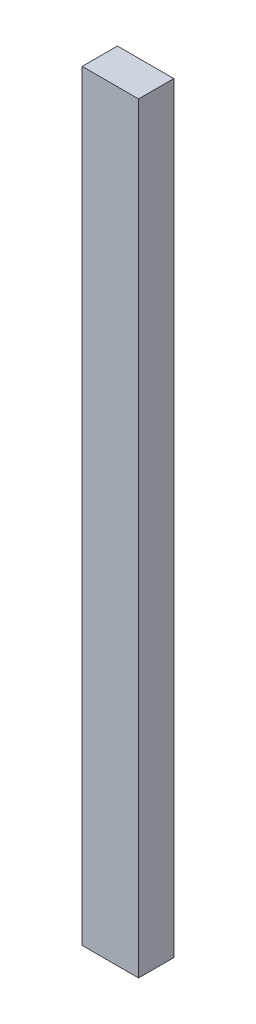
ISO-10303-21;
HEADER;
FILE_DESCRIPTION(('STEP AP214'),'2;1');
FILE_NAME('part.step','',(''),(''),'','','');
FILE_SCHEMA(('AUTOMOTIVE_DESIGN { 1 0 10303 214 1 1 1 1 }'));
ENDSEC;
DATA;
#1=APPLICATION_CONTEXT('core data for automotive mechanical design processes');
#2=APPLICATION_PROTOCOL_DEFINITION('international standard','automotive_design',2000,#1);
#3=PRODUCT_CONTEXT('',#1,'mechanical');
#4=PRODUCT('Part','Part','',(#3));
#5=PRODUCT_RELATED_PRODUCT_CATEGORY('part','',(#4));
#6=PRODUCT_DEFINITION_FORMATION('','',#4);
#7=PRODUCT_DEFINITION_CONTEXT('part definition',#1,'design');
#8=PRODUCT_DEFINITION('design','',#6,#7);
#9=PRODUCT_DEFINITION_SHAPE('','',#8);
#10=(LENGTH_UNIT() NAMED_UNIT(*) SI_UNIT(.MILLI.,.METRE.));
#11=(NAMED_UNIT(*) PLANE_ANGLE_UNIT() SI_UNIT($,.RADIAN.));
#12=(NAMED_UNIT(*) SI_UNIT($,.STERADIAN.) SOLID_ANGLE_UNIT());
#13=UNCERTAINTY_MEASURE_WITH_UNIT(LENGTH_MEASURE(1.E-05),#10,'distance_accuracy_value','');
#14=(GEOMETRIC_REPRESENTATION_CONTEXT(3) GLOBAL_UNCERTAINTY_ASSIGNED_CONTEXT((#13)) GLOBAL_UNIT_ASSIGNED_CONTEXT((#10,
#11,#12)) REPRESENTATION_CONTEXT('',''));
#15=CARTESIAN_POINT('',(0.,0.,0.));
#16=DIRECTION('',(0.,0.,1.));
#17=DIRECTION('',(1.,0.,0.));
#18=AXIS2_PLACEMENT_3D('',#15,#16,#17);
#19=CARTESIAN_POINT('',(0.,0.,25.));
#20=DIRECTION('',(1.,0.,0.));
#21=DIRECTION('',(0.,0.,-1.));
#22=AXIS2_PLACEMENT_3D('',#19,#20,#21);
#23=PLANE('',#22);
#24=DIRECTION('',(0.,-1.,0.));
#25=VECTOR('',#24,1.);
#26=CARTESIAN_POINT('',(0.,0.,0.));
#27=LINE('',#26,#25);
#28=CARTESIAN_POINT('',(0.,540.,0.));
#29=VERTEX_POINT('',#28);
#30=CARTESIAN_POINT('',(0.,0.,0.));
#31=VERTEX_POINT('',#30);
#32=EDGE_CURVE('E95',#29,#31,#27,.T.);
#33=ORIENTED_EDGE('',*,*,#32,.T.);
#34=DIRECTION('',(0.,0.,-1.));
#35=VECTOR('',#34,1.);
#36=CARTESIAN_POINT('',(0.,0.,25.));
#37=LINE('',#36,#35);
#38=CARTESIAN_POINT('',(0.,0.,25.));
#39=VERTEX_POINT('',#38);
#40=EDGE_CURVE('E11',#39,#31,#37,.T.);
#41=ORIENTED_EDGE('',*,*,#40,.F.);
#42=DIRECTION('',(0.,-1.,0.));
#43=VECTOR('',#42,1.);
#44=CARTESIAN_POINT('',(0.,0.,25.));
#45=LINE('',#44,#43);
#46=CARTESIAN_POINT('',(0.,540.,25.));
#47=VERTEX_POINT('',#46);
#48=EDGE_CURVE('E83',#47,#39,#45,.T.);
#49=ORIENTED_EDGE('',*,*,#48,.F.);
#50=DIRECTION('',(0.,0.,-1.));
#51=VECTOR('',#50,1.);
#52=CARTESIAN_POINT('',(0.,540.,25.));
#53=LINE('',#52,#51);
#54=EDGE_CURVE('E91',#47,#29,#53,.T.);
#55=ORIENTED_EDGE('',*,*,#54,.T.);
#56=EDGE_LOOP('',(#33,#41,#49,#55));
#57=FACE_BOUND('',#56,.T.);
#58=ADVANCED_FACE('F32',(#57),#23,.F.);
#59=CARTESIAN_POINT('',(0.,0.,25.));
#60=DIRECTION('',(0.,1.,0.));
#61=DIRECTION('',(0.,0.,1.));
#62=AXIS2_PLACEMENT_3D('',#59,#60,#61);
#63=PLANE('',#62);
#64=DIRECTION('',(1.,0.,0.));
#65=VECTOR('',#64,1.);
#66=CARTESIAN_POINT('',(0.,0.,0.));
#67=LINE('',#66,#65);
#68=CARTESIAN_POINT('',(40.,0.,0.));
#69=VERTEX_POINT('',#68);
#70=EDGE_CURVE('E87',#31,#69,#67,.T.);
#71=ORIENTED_EDGE('',*,*,#70,.T.);
#72=DIRECTION('',(0.,0.,-1.));
#73=VECTOR('',#72,1.);
#74=CARTESIAN_POINT('',(40.,0.,25.));
#75=LINE('',#74,#73);
#76=CARTESIAN_POINT('',(40.,0.,25.));
#77=VERTEX_POINT('',#76);
#78=EDGE_CURVE('E40',#77,#69,#75,.T.);
#79=ORIENTED_EDGE('',*,*,#78,.F.);
#80=DIRECTION('',(1.,0.,0.));
#81=VECTOR('',#80,1.);
#82=CARTESIAN_POINT('',(0.,0.,25.));
#83=LINE('',#82,#81);
#84=EDGE_CURVE('E78',#39,#77,#83,.T.);
#85=ORIENTED_EDGE('',*,*,#84,.F.);
#86=ORIENTED_EDGE('',*,*,#40,.T.);
#87=EDGE_LOOP('',(#71,#79,#85,#86));
#88=FACE_BOUND('',#87,.T.);
#89=ADVANCED_FACE('F86',(#88),#63,.F.);
#90=CARTESIAN_POINT('',(40.,0.,25.));
#91=DIRECTION('',(-1.,0.,0.));
#92=DIRECTION('',(0.,0.,1.));
#93=AXIS2_PLACEMENT_3D('',#90,#91,#92);
#94=PLANE('',#93);
#95=DIRECTION('',(0.,1.,0.));
#96=VECTOR('',#95,1.);
#97=CARTESIAN_POINT('',(40.,0.,0.));
#98=LINE('',#97,#96);
#99=CARTESIAN_POINT('',(40.,540.,0.));
#100=VERTEX_POINT('',#99);
#101=EDGE_CURVE('E65',#69,#100,#98,.T.);
#102=ORIENTED_EDGE('',*,*,#101,.T.);
#103=DIRECTION('',(0.,0.,-1.));
#104=VECTOR('',#103,1.);
#105=CARTESIAN_POINT('',(40.,540.,25.));
#106=LINE('',#105,#104);
#107=CARTESIAN_POINT('',(40.,540.,25.));
#108=VERTEX_POINT('',#107);
#109=EDGE_CURVE('E88',#108,#100,#106,.T.);
#110=ORIENTED_EDGE('',*,*,#109,.F.);
#111=DIRECTION('',(0.,1.,0.));
#112=VECTOR('',#111,1.);
#113=CARTESIAN_POINT('',(40.,0.,25.));
#114=LINE('',#113,#112);
#115=EDGE_CURVE('E81',#77,#108,#114,.T.);
#116=ORIENTED_EDGE('',*,*,#115,.F.);
#117=ORIENTED_EDGE('',*,*,#78,.T.);
#118=EDGE_LOOP('',(#102,#110,#116,#117));
#119=FACE_BOUND('',#118,.T.);
#120=ADVANCED_FACE('F89',(#119),#94,.F.);
#121=CARTESIAN_POINT('',(0.,540.,25.));
#122=DIRECTION('',(0.,-1.,0.));
#123=DIRECTION('',(0.,0.,-1.));
#124=AXIS2_PLACEMENT_3D('',#121,#122,#123);
#125=PLANE('',#124);
#126=DIRECTION('',(-1.,0.,0.));
#127=VECTOR('',#126,1.);
#128=CARTESIAN_POINT('',(0.,540.,0.));
#129=LINE('',#128,#127);
#130=EDGE_CURVE('E71',#100,#29,#129,.T.);
#131=ORIENTED_EDGE('',*,*,#130,.T.);
#132=ORIENTED_EDGE('',*,*,#54,.F.);
#133=DIRECTION('',(-1.,0.,0.));
#134=VECTOR('',#133,1.);
#135=CARTESIAN_POINT('',(0.,540.,25.));
#136=LINE('',#135,#134);
#137=EDGE_CURVE('E48',#108,#47,#136,.T.);
#138=ORIENTED_EDGE('',*,*,#137,.F.);
#139=ORIENTED_EDGE('',*,*,#109,.T.);
#140=EDGE_LOOP('',(#131,#132,#138,#139));
#141=FACE_BOUND('',#140,.T.);
#142=ADVANCED_FACE('F102',(#141),#125,.F.);
#143=CARTESIAN_POINT('',(0.,0.,25.));
#144=DIRECTION('',(0.,0.,-1.));
#145=DIRECTION('',(-1.,0.,0.));
#146=AXIS2_PLACEMENT_3D('',#143,#144,#145);
#147=PLANE('',#146);
#148=ORIENTED_EDGE('',*,*,#48,.T.);
#149=ORIENTED_EDGE('',*,*,#84,.T.);
#150=ORIENTED_EDGE('',*,*,#115,.T.);
#151=ORIENTED_EDGE('',*,*,#137,.T.);
#152=EDGE_LOOP('',(#148,#149,#150,#151));
#153=FACE_BOUND('',#152,.T.);
#154=ADVANCED_FACE('F79',(#153),#147,.F.);
#155=CARTESIAN_POINT('',(0.,0.,0.));
#156=DIRECTION('',(0.,0.,-1.));
#157=DIRECTION('',(-1.,0.,0.));
#158=AXIS2_PLACEMENT_3D('',#155,#156,#157);
#159=PLANE('',#158);
#160=ORIENTED_EDGE('',*,*,#32,.F.);
#161=ORIENTED_EDGE('',*,*,#130,.F.);
#162=ORIENTED_EDGE('',*,*,#101,.F.);
#163=ORIENTED_EDGE('',*,*,#70,.F.);
#164=EDGE_LOOP('',(#160,#161,#162,#163));
#165=FACE_BOUND('',#164,.T.);
#166=ADVANCED_FACE('F105',(#165),#159,.T.);
#167=CLOSED_SHELL('',(#58,#89,#120,#142,#154,#166));
#168=MANIFOLD_SOLID_BREP('B2',#167);
#169=ADVANCED_BREP_SHAPE_REPRESENTATION('',(#18,#168),#14);
#170=SHAPE_DEFINITION_REPRESENTATION(#9,#169);
ENDSEC;
END-ISO-10303-21;
